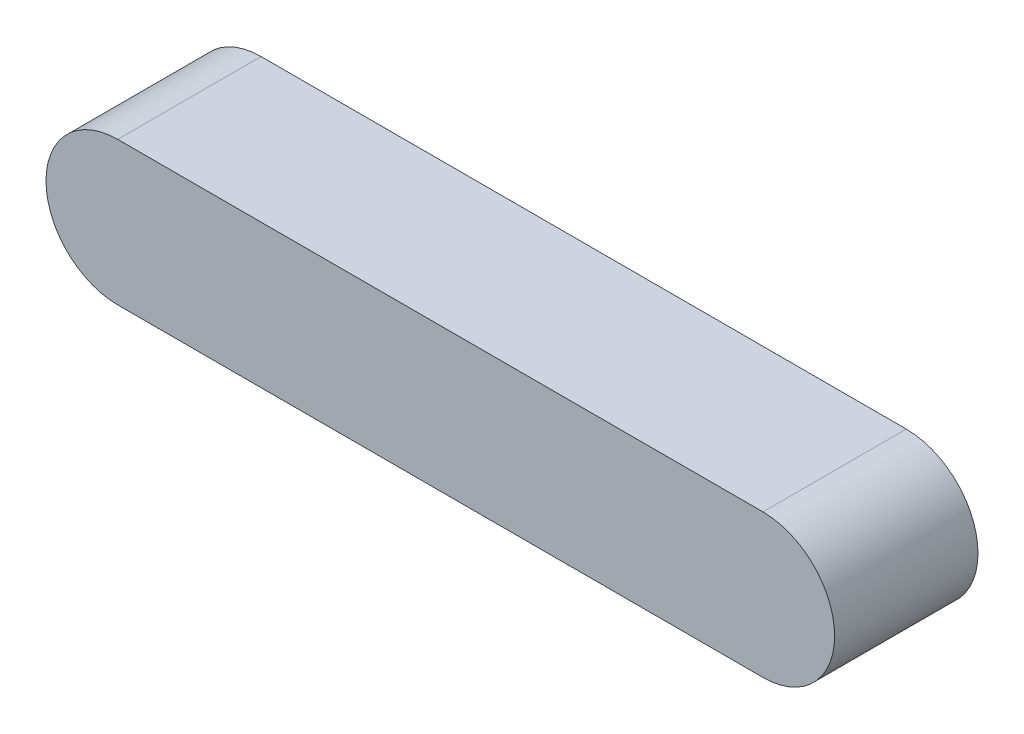
ISO-10303-21;
HEADER;
FILE_DESCRIPTION(('STEP AP214'),'2;1');
FILE_NAME('part.step','',(''),(''),'','','');
FILE_SCHEMA(('AUTOMOTIVE_DESIGN { 1 0 10303 214 1 1 1 1 }'));
ENDSEC;
DATA;
#1=APPLICATION_CONTEXT('core data for automotive mechanical design processes');
#2=APPLICATION_PROTOCOL_DEFINITION('international standard','automotive_design',2000,#1);
#3=PRODUCT_CONTEXT('',#1,'mechanical');
#4=PRODUCT('Part','Part','',(#3));
#5=PRODUCT_RELATED_PRODUCT_CATEGORY('part','',(#4));
#6=PRODUCT_DEFINITION_FORMATION('','',#4);
#7=PRODUCT_DEFINITION_CONTEXT('part definition',#1,'design');
#8=PRODUCT_DEFINITION('design','',#6,#7);
#9=PRODUCT_DEFINITION_SHAPE('','',#8);
#10=(LENGTH_UNIT() NAMED_UNIT(*) SI_UNIT(.MILLI.,.METRE.));
#11=(NAMED_UNIT(*) PLANE_ANGLE_UNIT() SI_UNIT($,.RADIAN.));
#12=(NAMED_UNIT(*) SI_UNIT($,.STERADIAN.) SOLID_ANGLE_UNIT());
#13=UNCERTAINTY_MEASURE_WITH_UNIT(LENGTH_MEASURE(1.E-05),#10,'distance_accuracy_value','');
#14=(GEOMETRIC_REPRESENTATION_CONTEXT(3) GLOBAL_UNCERTAINTY_ASSIGNED_CONTEXT((#13)) GLOBAL_UNIT_ASSIGNED_CONTEXT((#10,
#11,#12)) REPRESENTATION_CONTEXT('',''));
#15=CARTESIAN_POINT('',(0.,0.,0.));
#16=DIRECTION('',(0.,0.,1.));
#17=DIRECTION('',(1.,0.,0.));
#18=AXIS2_PLACEMENT_3D('',#15,#16,#17);
#19=CARTESIAN_POINT('',(0.,0.,4.));
#20=DIRECTION('',(0.,0.,-1.));
#21=DIRECTION('',(-1.,0.,0.));
#22=AXIS2_PLACEMENT_3D('',#19,#20,#21);
#23=CYLINDRICAL_SURFACE('',#22,2.);
#24=CARTESIAN_POINT('',(0.,0.,0.));
#25=DIRECTION('',(0.,0.,1.));
#26=DIRECTION('',(1.,0.,0.));
#27=AXIS2_PLACEMENT_3D('',#24,#25,#26);
#28=CIRCLE('',#27,2.);
#29=CARTESIAN_POINT('',(0.,2.,0.));
#30=VERTEX_POINT('',#29);
#31=CARTESIAN_POINT('',(0.,-2.,0.));
#32=VERTEX_POINT('',#31);
#33=EDGE_CURVE('E95',#30,#32,#28,.T.);
#34=ORIENTED_EDGE('',*,*,#33,.T.);
#35=DIRECTION('',(0.,0.,-1.));
#36=VECTOR('',#35,1.);
#37=CARTESIAN_POINT('',(0.,-2.,4.));
#38=LINE('',#37,#36);
#39=CARTESIAN_POINT('',(0.,-2.,4.));
#40=VERTEX_POINT('',#39);
#41=EDGE_CURVE('E11',#40,#32,#38,.T.);
#42=ORIENTED_EDGE('',*,*,#41,.F.);
#43=CARTESIAN_POINT('',(0.,0.,4.));
#44=DIRECTION('',(0.,0.,1.));
#45=DIRECTION('',(1.,0.,0.));
#46=AXIS2_PLACEMENT_3D('',#43,#44,#45);
#47=CIRCLE('',#46,2.);
#48=CARTESIAN_POINT('',(0.,2.,4.));
#49=VERTEX_POINT('',#48);
#50=EDGE_CURVE('E83',#49,#40,#47,.T.);
#51=ORIENTED_EDGE('',*,*,#50,.F.);
#52=DIRECTION('',(0.,0.,-1.));
#53=VECTOR('',#52,1.);
#54=CARTESIAN_POINT('',(0.,2.,4.));
#55=LINE('',#54,#53);
#56=EDGE_CURVE('E91',#49,#30,#55,.T.);
#57=ORIENTED_EDGE('',*,*,#56,.T.);
#58=EDGE_LOOP('',(#34,#42,#51,#57));
#59=FACE_BOUND('',#58,.T.);
#60=ADVANCED_FACE('F32',(#59),#23,.T.);
#61=CARTESIAN_POINT('',(0.,-2.,4.));
#62=DIRECTION('',(0.,1.,0.));
#63=DIRECTION('',(0.,0.,1.));
#64=AXIS2_PLACEMENT_3D('',#61,#62,#63);
#65=PLANE('',#64);
#66=DIRECTION('',(1.,0.,0.));
#67=VECTOR('',#66,1.);
#68=CARTESIAN_POINT('',(0.,-2.,0.));
#69=LINE('',#68,#67);
#70=CARTESIAN_POINT('',(18.,-2.,0.));
#71=VERTEX_POINT('',#70);
#72=EDGE_CURVE('E87',#32,#71,#69,.T.);
#73=ORIENTED_EDGE('',*,*,#72,.T.);
#74=DIRECTION('',(0.,0.,-1.));
#75=VECTOR('',#74,1.);
#76=CARTESIAN_POINT('',(18.,-2.,4.));
#77=LINE('',#76,#75);
#78=CARTESIAN_POINT('',(18.,-2.,4.));
#79=VERTEX_POINT('',#78);
#80=EDGE_CURVE('E40',#79,#71,#77,.T.);
#81=ORIENTED_EDGE('',*,*,#80,.F.);
#82=DIRECTION('',(1.,0.,0.));
#83=VECTOR('',#82,1.);
#84=CARTESIAN_POINT('',(0.,-2.,4.));
#85=LINE('',#84,#83);
#86=EDGE_CURVE('E78',#40,#79,#85,.T.);
#87=ORIENTED_EDGE('',*,*,#86,.F.);
#88=ORIENTED_EDGE('',*,*,#41,.T.);
#89=EDGE_LOOP('',(#73,#81,#87,#88));
#90=FACE_BOUND('',#89,.T.);
#91=ADVANCED_FACE('F86',(#90),#65,.F.);
#92=CARTESIAN_POINT('',(18.,0.,4.));
#93=DIRECTION('',(0.,0.,-1.));
#94=DIRECTION('',(-1.,0.,0.));
#95=AXIS2_PLACEMENT_3D('',#92,#93,#94);
#96=CYLINDRICAL_SURFACE('',#95,2.);
#97=CARTESIAN_POINT('',(18.,0.,0.));
#98=DIRECTION('',(0.,0.,1.));
#99=DIRECTION('',(1.,0.,0.));
#100=AXIS2_PLACEMENT_3D('',#97,#98,#99);
#101=CIRCLE('',#100,2.);
#102=CARTESIAN_POINT('',(18.,2.,0.));
#103=VERTEX_POINT('',#102);
#104=EDGE_CURVE('E65',#71,#103,#101,.T.);
#105=ORIENTED_EDGE('',*,*,#104,.T.);
#106=DIRECTION('',(0.,0.,-1.));
#107=VECTOR('',#106,1.);
#108=CARTESIAN_POINT('',(18.,2.,4.));
#109=LINE('',#108,#107);
#110=CARTESIAN_POINT('',(18.,2.,4.));
#111=VERTEX_POINT('',#110);
#112=EDGE_CURVE('E88',#111,#103,#109,.T.);
#113=ORIENTED_EDGE('',*,*,#112,.F.);
#114=CARTESIAN_POINT('',(18.,0.,4.));
#115=DIRECTION('',(0.,0.,1.));
#116=DIRECTION('',(1.,0.,0.));
#117=AXIS2_PLACEMENT_3D('',#114,#115,#116);
#118=CIRCLE('',#117,2.);
#119=EDGE_CURVE('E81',#79,#111,#118,.T.);
#120=ORIENTED_EDGE('',*,*,#119,.F.);
#121=ORIENTED_EDGE('',*,*,#80,.T.);
#122=EDGE_LOOP('',(#105,#113,#120,#121));
#123=FACE_BOUND('',#122,.T.);
#124=ADVANCED_FACE('F89',(#123),#96,.T.);
#125=CARTESIAN_POINT('',(0.,2.,4.));
#126=DIRECTION('',(0.,-1.,0.));
#127=DIRECTION('',(0.,0.,-1.));
#128=AXIS2_PLACEMENT_3D('',#125,#126,#127);
#129=PLANE('',#128);
#130=DIRECTION('',(-1.,0.,0.));
#131=VECTOR('',#130,1.);
#132=CARTESIAN_POINT('',(0.,2.,0.));
#133=LINE('',#132,#131);
#134=EDGE_CURVE('E71',#103,#30,#133,.T.);
#135=ORIENTED_EDGE('',*,*,#134,.T.);
#136=ORIENTED_EDGE('',*,*,#56,.F.);
#137=DIRECTION('',(-1.,0.,0.));
#138=VECTOR('',#137,1.);
#139=CARTESIAN_POINT('',(0.,2.,4.));
#140=LINE('',#139,#138);
#141=EDGE_CURVE('E48',#111,#49,#140,.T.);
#142=ORIENTED_EDGE('',*,*,#141,.F.);
#143=ORIENTED_EDGE('',*,*,#112,.T.);
#144=EDGE_LOOP('',(#135,#136,#142,#143));
#145=FACE_BOUND('',#144,.T.);
#146=ADVANCED_FACE('F102',(#145),#129,.F.);
#147=CARTESIAN_POINT('',(0.,0.,4.));
#148=DIRECTION('',(0.,0.,1.));
#149=DIRECTION('',(1.,0.,0.));
#150=AXIS2_PLACEMENT_3D('',#147,#148,#149);
#151=PLANE('',#150);
#152=ORIENTED_EDGE('',*,*,#50,.T.);
#153=ORIENTED_EDGE('',*,*,#86,.T.);
#154=ORIENTED_EDGE('',*,*,#119,.T.);
#155=ORIENTED_EDGE('',*,*,#141,.T.);
#156=EDGE_LOOP('',(#152,#153,#154,#155));
#157=FACE_BOUND('',#156,.T.);
#158=ADVANCED_FACE('F79',(#157),#151,.T.);
#159=CARTESIAN_POINT('',(0.,0.,0.));
#160=DIRECTION('',(0.,0.,1.));
#161=DIRECTION('',(1.,0.,0.));
#162=AXIS2_PLACEMENT_3D('',#159,#160,#161);
#163=PLANE('',#162);
#164=ORIENTED_EDGE('',*,*,#33,.F.);
#165=ORIENTED_EDGE('',*,*,#134,.F.);
#166=ORIENTED_EDGE('',*,*,#104,.F.);
#167=ORIENTED_EDGE('',*,*,#72,.F.);
#168=EDGE_LOOP('',(#164,#165,#166,#167));
#169=FACE_BOUND('',#168,.T.);
#170=ADVANCED_FACE('F105',(#169),#163,.F.);
#171=CLOSED_SHELL('',(#60,#91,#124,#146,#158,#170));
#172=MANIFOLD_SOLID_BREP('B2',#171);
#173=ADVANCED_BREP_SHAPE_REPRESENTATION('',(#18,#172),#14);
#174=SHAPE_DEFINITION_REPRESENTATION(#9,#173);
ENDSEC;
END-ISO-10303-21;
